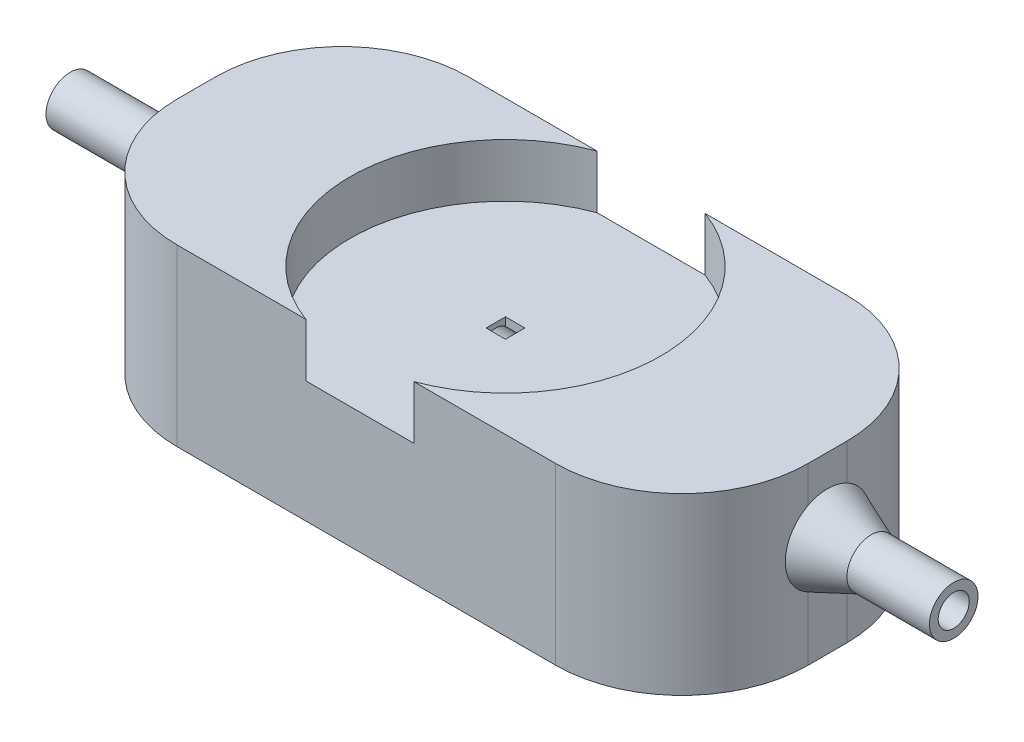
ISO-10303-21;
HEADER;
FILE_DESCRIPTION(('STEP AP214'),'2;1');
FILE_NAME('part.step','',(''),(''),'','','');
FILE_SCHEMA(('AUTOMOTIVE_DESIGN { 1 0 10303 214 1 1 1 1 }'));
ENDSEC;
DATA;
#1=APPLICATION_CONTEXT('core data for automotive mechanical design processes');
#2=APPLICATION_PROTOCOL_DEFINITION('international standard','automotive_design',2000,#1);
#3=PRODUCT_CONTEXT('',#1,'mechanical');
#4=PRODUCT('Part','Part','',(#3));
#5=PRODUCT_RELATED_PRODUCT_CATEGORY('part','',(#4));
#6=PRODUCT_DEFINITION_FORMATION('','',#4);
#7=PRODUCT_DEFINITION_CONTEXT('part definition',#1,'design');
#8=PRODUCT_DEFINITION('design','',#6,#7);
#9=PRODUCT_DEFINITION_SHAPE('','',#8);
#10=(LENGTH_UNIT() NAMED_UNIT(*) SI_UNIT(.MILLI.,.METRE.));
#11=(NAMED_UNIT(*) PLANE_ANGLE_UNIT() SI_UNIT($,.RADIAN.));
#12=(NAMED_UNIT(*) SI_UNIT($,.STERADIAN.) SOLID_ANGLE_UNIT());
#13=UNCERTAINTY_MEASURE_WITH_UNIT(LENGTH_MEASURE(1.E-05),#10,'distance_accuracy_value','');
#14=(GEOMETRIC_REPRESENTATION_CONTEXT(3) GLOBAL_UNCERTAINTY_ASSIGNED_CONTEXT((#13)) GLOBAL_UNIT_ASSIGNED_CONTEXT((#10,
#11,#12)) REPRESENTATION_CONTEXT('',''));
#15=CARTESIAN_POINT('',(0.,0.,0.));
#16=DIRECTION('',(0.,0.,1.));
#17=DIRECTION('',(1.,0.,0.));
#18=AXIS2_PLACEMENT_3D('',#15,#16,#17);
#19=CARTESIAN_POINT('',(40.,58.,15.));
#20=DIRECTION('',(-1.,0.,0.));
#21=DIRECTION('',(0.,0.,1.));
#22=AXIS2_PLACEMENT_3D('',#19,#20,#21);
#23=PLANE('',#22);
#24=DIRECTION('',(0.,-1.,0.));
#25=VECTOR('',#24,1.);
#26=CARTESIAN_POINT('',(40.,58.,2.00000000000001));
#27=LINE('',#26,#25);
#28=CARTESIAN_POINT('',(40.,58.,2.00000000000001));
#29=VERTEX_POINT('',#28);
#30=CARTESIAN_POINT('',(40.,54.2615312920012,2.00000000000001));
#31=VERTEX_POINT('',#30);
#32=EDGE_CURVE('E308',#29,#31,#27,.T.);
#33=ORIENTED_EDGE('',*,*,#32,.T.);
#34=CARTESIAN_POINT('',(40.,50.3985661096575,0.));
#35=DIRECTION('',(1.,0.,0.));
#36=DIRECTION('',(0.,0.,-1.));
#37=AXIS2_PLACEMENT_3D('',#34,#35,#36);
#38=CIRCLE('',#37,4.35);
#39=CARTESIAN_POINT('',(40.,54.2615312920012,-2.));
#40=VERTEX_POINT('',#39);
#41=EDGE_CURVE('E65',#40,#31,#38,.T.);
#42=ORIENTED_EDGE('',*,*,#41,.F.);
#43=DIRECTION('',(0.,-1.,0.));
#44=VECTOR('',#43,1.);
#45=CARTESIAN_POINT('',(40.,58.,-2.));
#46=LINE('',#45,#44);
#47=CARTESIAN_POINT('',(40.,58.,-2.));
#48=VERTEX_POINT('',#47);
#49=EDGE_CURVE('E313',#40,#48,#46,.F.);
#50=ORIENTED_EDGE('',*,*,#49,.T.);
#51=DIRECTION('',(0.,0.,-1.));
#52=VECTOR('',#51,1.);
#53=CARTESIAN_POINT('',(40.,58.,15.));
#54=LINE('',#53,#52);
#55=EDGE_CURVE('E311',#29,#48,#54,.T.);
#56=ORIENTED_EDGE('',*,*,#55,.F.);
#57=EDGE_LOOP('',(#33,#42,#50,#56));
#58=FACE_BOUND('',#57,.T.);
#59=ADVANCED_FACE('F45',(#58),#23,.F.);
#60=CARTESIAN_POINT('',(-25.,58.,15.));
#61=DIRECTION('',(1.,0.,0.));
#62=DIRECTION('',(0.,0.,-1.));
#63=AXIS2_PLACEMENT_3D('',#60,#61,#62);
#64=PLANE('',#63);
#65=DIRECTION('',(0.,-1.,0.));
#66=VECTOR('',#65,1.);
#67=CARTESIAN_POINT('',(-25.,58.,-1.99999999999999));
#68=LINE('',#67,#66);
#69=CARTESIAN_POINT('',(-25.,58.,-1.99999999999999));
#70=VERTEX_POINT('',#69);
#71=CARTESIAN_POINT('',(-25.,54.2628421718626,-1.99999999999999));
#72=VERTEX_POINT('',#71);
#73=EDGE_CURVE('E505',#70,#72,#68,.T.);
#74=ORIENTED_EDGE('',*,*,#73,.T.);
#75=CARTESIAN_POINT('',(-25.,50.4,0.));
#76=DIRECTION('',(1.,0.,0.));
#77=DIRECTION('',(0.,0.,-1.));
#78=AXIS2_PLACEMENT_3D('',#75,#76,#77);
#79=CIRCLE('',#78,4.34989076238934);
#80=CARTESIAN_POINT('',(-25.,54.2628421718626,2.00000000000001));
#81=VERTEX_POINT('',#80);
#82=EDGE_CURVE('E388',#72,#81,#79,.T.);
#83=ORIENTED_EDGE('',*,*,#82,.T.);
#84=DIRECTION('',(0.,-1.,0.));
#85=VECTOR('',#84,1.);
#86=CARTESIAN_POINT('',(-25.,58.,2.00000000000001));
#87=LINE('',#86,#85);
#88=CARTESIAN_POINT('',(-25.,58.,2.00000000000001));
#89=VERTEX_POINT('',#88);
#90=EDGE_CURVE('E500',#81,#89,#87,.F.);
#91=ORIENTED_EDGE('',*,*,#90,.T.);
#92=DIRECTION('',(0.,0.,1.));
#93=VECTOR('',#92,1.);
#94=CARTESIAN_POINT('',(-25.,58.,15.));
#95=LINE('',#94,#93);
#96=EDGE_CURVE('E477',#70,#89,#95,.T.);
#97=ORIENTED_EDGE('',*,*,#96,.F.);
#98=EDGE_LOOP('',(#74,#83,#91,#97));
#99=FACE_BOUND('',#98,.T.);
#100=ADVANCED_FACE('F279',(#99),#64,.F.);
#101=CARTESIAN_POINT('',(0.,58.,0.));
#102=DIRECTION('',(0.,-1.,0.));
#103=DIRECTION('',(0.,0.,-1.));
#104=AXIS2_PLACEMENT_3D('',#101,#102,#103);
#105=PLANE('',#104);
#106=DIRECTION('',(-1.,0.,0.));
#107=VECTOR('',#106,1.);
#108=CARTESIAN_POINT('',(-25.,58.,-15.));
#109=LINE('',#108,#107);
#110=CARTESIAN_POINT('',(27.,58.,-15.));
#111=VERTEX_POINT('',#110);
#112=CARTESIAN_POINT('',(12.3962726493241,58.,-15.));
#113=VERTEX_POINT('',#112);
#114=EDGE_CURVE('E474',#111,#113,#109,.T.);
#115=ORIENTED_EDGE('',*,*,#114,.T.);
#116=CARTESIAN_POINT('',(6.82850828649366,58.,-1.6826817716975E-13));
#117=DIRECTION('',(0.,1.,0.));
#118=DIRECTION('',(0.,0.,1.));
#119=AXIS2_PLACEMENT_3D('',#116,#117,#118);
#120=CIRCLE('',#119,16.);
#121=CARTESIAN_POINT('',(12.3962726493232,58.,15.));
#122=VERTEX_POINT('',#121);
#123=EDGE_CURVE('E226',#122,#113,#120,.T.);
#124=ORIENTED_EDGE('',*,*,#123,.F.);
#125=DIRECTION('',(1.,0.,0.));
#126=VECTOR('',#125,1.);
#127=CARTESIAN_POINT('',(-25.,58.,15.));
#128=LINE('',#127,#126);
#129=CARTESIAN_POINT('',(27.,58.,15.));
#130=VERTEX_POINT('',#129);
#131=EDGE_CURVE('E480',#122,#130,#128,.T.);
#132=ORIENTED_EDGE('',*,*,#131,.T.);
#133=CARTESIAN_POINT('',(27.,58.,2.00000000000001));
#134=DIRECTION('',(0.,-1.,0.));
#135=DIRECTION('',(0.,0.,-1.));
#136=AXIS2_PLACEMENT_3D('',#133,#134,#135);
#137=CIRCLE('',#136,13.);
#138=EDGE_CURVE('E494',#130,#29,#137,.F.);
#139=ORIENTED_EDGE('',*,*,#138,.T.);
#140=ORIENTED_EDGE('',*,*,#55,.T.);
#141=CARTESIAN_POINT('',(27.,58.,-2.));
#142=DIRECTION('',(0.,-1.,0.));
#143=DIRECTION('',(0.,0.,-1.));
#144=AXIS2_PLACEMENT_3D('',#141,#142,#143);
#145=CIRCLE('',#144,13.);
#146=EDGE_CURVE('E498',#48,#111,#145,.F.);
#147=ORIENTED_EDGE('',*,*,#146,.T.);
#148=EDGE_LOOP('',(#115,#124,#132,#139,#140,#147));
#149=FACE_BOUND('',#148,.T.);
#150=ADVANCED_FACE('F268',(#149),#105,.F.);
#151=CARTESIAN_POINT('',(40.,40.,-2.));
#152=VERTEX_POINT('',#151);
#153=CARTESIAN_POINT('',(40.,46.5356009273137,-2.));
#154=VERTEX_POINT('',#153);
#155=EDGE_CURVE('E490',#152,#154,#46,.F.);
#156=ORIENTED_EDGE('',*,*,#155,.T.);
#157=CARTESIAN_POINT('',(40.,46.5356009273137,2.00000000000001));
#158=VERTEX_POINT('',#157);
#159=EDGE_CURVE('E323',#158,#154,#38,.T.);
#160=ORIENTED_EDGE('',*,*,#159,.F.);
#161=CARTESIAN_POINT('',(40.,40.,2.00000000000001));
#162=VERTEX_POINT('',#161);
#163=EDGE_CURVE('E314',#158,#162,#27,.T.);
#164=ORIENTED_EDGE('',*,*,#163,.T.);
#165=DIRECTION('',(0.,0.,1.));
#166=VECTOR('',#165,1.);
#167=CARTESIAN_POINT('',(40.,40.,15.));
#168=LINE('',#167,#166);
#169=EDGE_CURVE('E466',#152,#162,#168,.T.);
#170=ORIENTED_EDGE('',*,*,#169,.F.);
#171=EDGE_LOOP('',(#156,#160,#164,#170));
#172=FACE_BOUND('',#171,.T.);
#173=ADVANCED_FACE('F282',(#172),#23,.F.);
#174=CARTESIAN_POINT('',(-25.,58.,-15.));
#175=DIRECTION('',(0.,0.,1.));
#176=DIRECTION('',(1.,0.,0.));
#177=AXIS2_PLACEMENT_3D('',#174,#175,#176);
#178=PLANE('',#177);
#179=DIRECTION('',(-1.,0.,0.));
#180=VECTOR('',#179,1.);
#181=CARTESIAN_POINT('',(-25.,52.5,-15.));
#182=LINE('',#181,#180);
#183=CARTESIAN_POINT('',(12.3962726493241,52.5,-15.));
#184=VERTEX_POINT('',#183);
#185=CARTESIAN_POINT('',(1.26074392366317,52.5,-15.));
#186=VERTEX_POINT('',#185);
#187=EDGE_CURVE('E451',#184,#186,#182,.T.);
#188=ORIENTED_EDGE('',*,*,#187,.F.);
#189=DIRECTION('',(0.,1.,0.));
#190=VECTOR('',#189,1.);
#191=CARTESIAN_POINT('',(12.3962726493241,52.5,-15.));
#192=LINE('',#191,#190);
#193=EDGE_CURVE('E448',#184,#113,#192,.T.);
#194=ORIENTED_EDGE('',*,*,#193,.T.);
#195=ORIENTED_EDGE('',*,*,#114,.F.);
#196=DIRECTION('',(0.,-1.,0.));
#197=VECTOR('',#196,1.);
#198=CARTESIAN_POINT('',(27.,58.,-15.));
#199=LINE('',#198,#197);
#200=CARTESIAN_POINT('',(27.,40.,-15.));
#201=VERTEX_POINT('',#200);
#202=EDGE_CURVE('E487',#111,#201,#199,.T.);
#203=ORIENTED_EDGE('',*,*,#202,.T.);
#204=DIRECTION('',(1.,0.,0.));
#205=VECTOR('',#204,1.);
#206=CARTESIAN_POINT('',(-25.,40.,-15.));
#207=LINE('',#206,#205);
#208=CARTESIAN_POINT('',(-12.,40.,-15.));
#209=VERTEX_POINT('',#208);
#210=EDGE_CURVE('E464',#209,#201,#207,.T.);
#211=ORIENTED_EDGE('',*,*,#210,.F.);
#212=DIRECTION('',(0.,-1.,0.));
#213=VECTOR('',#212,1.);
#214=CARTESIAN_POINT('',(-12.,58.,-15.));
#215=LINE('',#214,#213);
#216=CARTESIAN_POINT('',(-12.,58.,-15.));
#217=VERTEX_POINT('',#216);
#218=EDGE_CURVE('E484',#209,#217,#215,.F.);
#219=ORIENTED_EDGE('',*,*,#218,.T.);
#220=CARTESIAN_POINT('',(1.26074392366317,58.,-15.));
#221=VERTEX_POINT('',#220);
#222=EDGE_CURVE('E473',#221,#217,#109,.T.);
#223=ORIENTED_EDGE('',*,*,#222,.F.);
#224=DIRECTION('',(0.,1.,0.));
#225=VECTOR('',#224,1.);
#226=CARTESIAN_POINT('',(1.26074392366316,52.5,-15.));
#227=LINE('',#226,#225);
#228=EDGE_CURVE('E445',#221,#186,#227,.F.);
#229=ORIENTED_EDGE('',*,*,#228,.T.);
#230=EDGE_LOOP('',(#188,#194,#195,#203,#211,#219,#223,#229));
#231=FACE_BOUND('',#230,.T.);
#232=ADVANCED_FACE('F277',(#231),#178,.F.);
#233=CARTESIAN_POINT('',(-25.,40.,2.00000000000001));
#234=VERTEX_POINT('',#233);
#235=CARTESIAN_POINT('',(-25.,46.5371578281374,2.00000000000001));
#236=VERTEX_POINT('',#235);
#237=EDGE_CURVE('E501',#234,#236,#87,.F.);
#238=ORIENTED_EDGE('',*,*,#237,.T.);
#239=CARTESIAN_POINT('',(-25.,46.5371578281374,-1.99999999999999));
#240=VERTEX_POINT('',#239);
#241=EDGE_CURVE('E625',#236,#240,#79,.T.);
#242=ORIENTED_EDGE('',*,*,#241,.T.);
#243=CARTESIAN_POINT('',(-25.,40.,-1.99999999999999));
#244=VERTEX_POINT('',#243);
#245=EDGE_CURVE('E504',#240,#244,#68,.T.);
#246=ORIENTED_EDGE('',*,*,#245,.T.);
#247=DIRECTION('',(0.,0.,-1.));
#248=VECTOR('',#247,1.);
#249=CARTESIAN_POINT('',(-25.,40.,15.));
#250=LINE('',#249,#248);
#251=EDGE_CURVE('E455',#234,#244,#250,.T.);
#252=ORIENTED_EDGE('',*,*,#251,.F.);
#253=EDGE_LOOP('',(#238,#242,#246,#252));
#254=FACE_BOUND('',#253,.T.);
#255=ADVANCED_FACE('F273',(#254),#64,.F.);
#256=CARTESIAN_POINT('',(-25.,58.,15.));
#257=DIRECTION('',(0.,0.,-1.));
#258=DIRECTION('',(-1.,0.,0.));
#259=AXIS2_PLACEMENT_3D('',#256,#257,#258);
#260=PLANE('',#259);
#261=DIRECTION('',(1.,0.,0.));
#262=VECTOR('',#261,1.);
#263=CARTESIAN_POINT('',(-25.,52.5,15.));
#264=LINE('',#263,#262);
#265=CARTESIAN_POINT('',(1.2607439236641,52.5,15.));
#266=VERTEX_POINT('',#265);
#267=CARTESIAN_POINT('',(12.3962726493232,52.5,15.));
#268=VERTEX_POINT('',#267);
#269=EDGE_CURVE('E520',#266,#268,#264,.T.);
#270=ORIENTED_EDGE('',*,*,#269,.F.);
#271=DIRECTION('',(0.,1.,0.));
#272=VECTOR('',#271,1.);
#273=CARTESIAN_POINT('',(1.26074392366409,52.5,15.));
#274=LINE('',#273,#272);
#275=CARTESIAN_POINT('',(1.2607439236641,58.,15.));
#276=VERTEX_POINT('',#275);
#277=EDGE_CURVE('E442',#266,#276,#274,.T.);
#278=ORIENTED_EDGE('',*,*,#277,.T.);
#279=CARTESIAN_POINT('',(-12.,58.,15.));
#280=VERTEX_POINT('',#279);
#281=EDGE_CURVE('E481',#280,#276,#128,.T.);
#282=ORIENTED_EDGE('',*,*,#281,.F.);
#283=DIRECTION('',(0.,-1.,0.));
#284=VECTOR('',#283,1.);
#285=CARTESIAN_POINT('',(-12.,58.,15.));
#286=LINE('',#285,#284);
#287=CARTESIAN_POINT('',(-12.,40.,15.));
#288=VERTEX_POINT('',#287);
#289=EDGE_CURVE('E508',#280,#288,#286,.T.);
#290=ORIENTED_EDGE('',*,*,#289,.T.);
#291=DIRECTION('',(-1.,0.,0.));
#292=VECTOR('',#291,1.);
#293=CARTESIAN_POINT('',(-25.,40.,15.));
#294=LINE('',#293,#292);
#295=CARTESIAN_POINT('',(27.,40.,15.));
#296=VERTEX_POINT('',#295);
#297=EDGE_CURVE('E453',#296,#288,#294,.T.);
#298=ORIENTED_EDGE('',*,*,#297,.F.);
#299=DIRECTION('',(0.,-1.,0.));
#300=VECTOR('',#299,1.);
#301=CARTESIAN_POINT('',(27.,58.,15.));
#302=LINE('',#301,#300);
#303=EDGE_CURVE('E511',#296,#130,#302,.F.);
#304=ORIENTED_EDGE('',*,*,#303,.T.);
#305=ORIENTED_EDGE('',*,*,#131,.F.);
#306=DIRECTION('',(0.,1.,0.));
#307=VECTOR('',#306,1.);
#308=CARTESIAN_POINT('',(12.3962726493232,52.5,15.));
#309=LINE('',#308,#307);
#310=EDGE_CURVE('E437',#122,#268,#309,.F.);
#311=ORIENTED_EDGE('',*,*,#310,.T.);
#312=EDGE_LOOP('',(#270,#278,#282,#290,#298,#304,#305,#311));
#313=FACE_BOUND('',#312,.T.);
#314=ADVANCED_FACE('F269',(#313),#260,.F.);
#315=CARTESIAN_POINT('',(27.,58.,-2.));
#316=DIRECTION('',(0.,-1.,0.));
#317=DIRECTION('',(0.,0.,-1.));
#318=AXIS2_PLACEMENT_3D('',#315,#316,#317);
#319=CYLINDRICAL_SURFACE('',#318,13.);
#320=ORIENTED_EDGE('',*,*,#155,.F.);
#321=CARTESIAN_POINT('',(27.,40.,-2.));
#322=DIRECTION('',(0.,-1.,0.));
#323=DIRECTION('',(0.,0.,-1.));
#324=AXIS2_PLACEMENT_3D('',#321,#322,#323);
#325=CIRCLE('',#324,13.);
#326=EDGE_CURVE('E469',#152,#201,#325,.F.);
#327=ORIENTED_EDGE('',*,*,#326,.T.);
#328=ORIENTED_EDGE('',*,*,#202,.F.);
#329=ORIENTED_EDGE('',*,*,#146,.F.);
#330=ORIENTED_EDGE('',*,*,#49,.F.);
#331=DIRECTION('',(0.,-1.,0.));
#332=VECTOR('',#331,1.);
#333=CARTESIAN_POINT('',(40.,58.,-2.));
#334=LINE('',#333,#332);
#335=EDGE_CURVE('E72',#154,#40,#334,.F.);
#336=ORIENTED_EDGE('',*,*,#335,.F.);
#337=EDGE_LOOP('',(#320,#327,#328,#329,#330,#336));
#338=FACE_BOUND('',#337,.T.);
#339=ADVANCED_FACE('F272',(#338),#319,.T.);
#340=CARTESIAN_POINT('',(-12.,58.,-1.99999999999999));
#341=DIRECTION('',(0.,-1.,0.));
#342=DIRECTION('',(0.,0.,-1.));
#343=AXIS2_PLACEMENT_3D('',#340,#341,#342);
#344=CYLINDRICAL_SURFACE('',#343,13.);
#345=ORIENTED_EDGE('',*,*,#218,.F.);
#346=CARTESIAN_POINT('',(-12.,40.,-1.99999999999999));
#347=DIRECTION('',(0.,-1.,0.));
#348=DIRECTION('',(0.,0.,-1.));
#349=AXIS2_PLACEMENT_3D('',#346,#347,#348);
#350=CIRCLE('',#349,13.);
#351=EDGE_CURVE('E461',#209,#244,#350,.F.);
#352=ORIENTED_EDGE('',*,*,#351,.T.);
#353=ORIENTED_EDGE('',*,*,#245,.F.);
#354=DIRECTION('',(0.,-1.,0.));
#355=VECTOR('',#354,1.);
#356=CARTESIAN_POINT('',(-25.,58.,-1.99999999999999));
#357=LINE('',#356,#355);
#358=EDGE_CURVE('E395',#240,#72,#357,.F.);
#359=ORIENTED_EDGE('',*,*,#358,.T.);
#360=ORIENTED_EDGE('',*,*,#73,.F.);
#361=CARTESIAN_POINT('',(-12.,58.,-1.99999999999999));
#362=DIRECTION('',(0.,-1.,0.));
#363=DIRECTION('',(0.,0.,-1.));
#364=AXIS2_PLACEMENT_3D('',#361,#362,#363);
#365=CIRCLE('',#364,13.);
#366=EDGE_CURVE('E496',#217,#70,#365,.F.);
#367=ORIENTED_EDGE('',*,*,#366,.F.);
#368=EDGE_LOOP('',(#345,#352,#353,#359,#360,#367));
#369=FACE_BOUND('',#368,.T.);
#370=ADVANCED_FACE('F289',(#369),#344,.T.);
#371=CARTESIAN_POINT('',(27.,58.,2.00000000000001));
#372=DIRECTION('',(0.,-1.,0.));
#373=DIRECTION('',(0.,0.,-1.));
#374=AXIS2_PLACEMENT_3D('',#371,#372,#373);
#375=CYLINDRICAL_SURFACE('',#374,13.);
#376=ORIENTED_EDGE('',*,*,#303,.F.);
#377=CARTESIAN_POINT('',(27.,40.,2.00000000000001));
#378=DIRECTION('',(0.,-1.,0.));
#379=DIRECTION('',(0.,0.,-1.));
#380=AXIS2_PLACEMENT_3D('',#377,#378,#379);
#381=CIRCLE('',#380,13.);
#382=EDGE_CURVE('E458',#296,#162,#381,.F.);
#383=ORIENTED_EDGE('',*,*,#382,.T.);
#384=ORIENTED_EDGE('',*,*,#163,.F.);
#385=DIRECTION('',(0.,-1.,0.));
#386=VECTOR('',#385,1.);
#387=CARTESIAN_POINT('',(40.,58.,2.00000000000001));
#388=LINE('',#387,#386);
#389=EDGE_CURVE('E232',#158,#31,#388,.F.);
#390=ORIENTED_EDGE('',*,*,#389,.T.);
#391=ORIENTED_EDGE('',*,*,#32,.F.);
#392=ORIENTED_EDGE('',*,*,#138,.F.);
#393=EDGE_LOOP('',(#376,#383,#384,#390,#391,#392));
#394=FACE_BOUND('',#393,.T.);
#395=ADVANCED_FACE('F291',(#394),#375,.T.);
#396=CARTESIAN_POINT('',(-12.,58.,2.00000000000001));
#397=DIRECTION('',(0.,-1.,0.));
#398=DIRECTION('',(0.,0.,-1.));
#399=AXIS2_PLACEMENT_3D('',#396,#397,#398);
#400=CYLINDRICAL_SURFACE('',#399,13.);
#401=ORIENTED_EDGE('',*,*,#237,.F.);
#402=CARTESIAN_POINT('',(-12.,40.,2.00000000000001));
#403=DIRECTION('',(0.,-1.,0.));
#404=DIRECTION('',(0.,0.,-1.));
#405=AXIS2_PLACEMENT_3D('',#402,#403,#404);
#406=CIRCLE('',#405,13.);
#407=EDGE_CURVE('E514',#234,#288,#406,.F.);
#408=ORIENTED_EDGE('',*,*,#407,.T.);
#409=ORIENTED_EDGE('',*,*,#289,.F.);
#410=CARTESIAN_POINT('',(-12.,58.,2.00000000000001));
#411=DIRECTION('',(0.,-1.,0.));
#412=DIRECTION('',(0.,0.,-1.));
#413=AXIS2_PLACEMENT_3D('',#410,#411,#412);
#414=CIRCLE('',#413,13.);
#415=EDGE_CURVE('E492',#89,#280,#414,.F.);
#416=ORIENTED_EDGE('',*,*,#415,.F.);
#417=ORIENTED_EDGE('',*,*,#90,.F.);
#418=DIRECTION('',(0.,-1.,0.));
#419=VECTOR('',#418,1.);
#420=CARTESIAN_POINT('',(-25.,58.,2.00000000000001));
#421=LINE('',#420,#419);
#422=EDGE_CURVE('E391',#236,#81,#421,.F.);
#423=ORIENTED_EDGE('',*,*,#422,.F.);
#424=EDGE_LOOP('',(#401,#408,#409,#416,#417,#423));
#425=FACE_BOUND('',#424,.T.);
#426=ADVANCED_FACE('F47',(#425),#400,.T.);
#427=ORIENTED_EDGE('',*,*,#281,.T.);
#428=CARTESIAN_POINT('',(6.82850828649366,58.,-1.6826817716975E-13));
#429=DIRECTION('',(0.,-1.,0.));
#430=DIRECTION('',(0.,0.,-1.));
#431=AXIS2_PLACEMENT_3D('',#428,#429,#430);
#432=CIRCLE('',#431,16.);
#433=EDGE_CURVE('E517',#276,#221,#432,.T.);
#434=ORIENTED_EDGE('',*,*,#433,.T.);
#435=ORIENTED_EDGE('',*,*,#222,.T.);
#436=ORIENTED_EDGE('',*,*,#366,.T.);
#437=ORIENTED_EDGE('',*,*,#96,.T.);
#438=ORIENTED_EDGE('',*,*,#415,.T.);
#439=EDGE_LOOP('',(#427,#434,#435,#436,#437,#438));
#440=FACE_BOUND('',#439,.T.);
#441=ADVANCED_FACE('F263',(#440),#105,.F.);
#442=CARTESIAN_POINT('',(0.,40.,0.));
#443=DIRECTION('',(0.,-1.,0.));
#444=DIRECTION('',(0.,0.,-1.));
#445=AXIS2_PLACEMENT_3D('',#442,#443,#444);
#446=PLANE('',#445);
#447=ORIENTED_EDGE('',*,*,#169,.T.);
#448=ORIENTED_EDGE('',*,*,#382,.F.);
#449=ORIENTED_EDGE('',*,*,#297,.T.);
#450=ORIENTED_EDGE('',*,*,#407,.F.);
#451=ORIENTED_EDGE('',*,*,#251,.T.);
#452=ORIENTED_EDGE('',*,*,#351,.F.);
#453=ORIENTED_EDGE('',*,*,#210,.T.);
#454=ORIENTED_EDGE('',*,*,#326,.F.);
#455=EDGE_LOOP('',(#447,#448,#449,#450,#451,#452,#453,#454));
#456=FACE_BOUND('',#455,.T.);
#457=ADVANCED_FACE('F256',(#456),#446,.T.);
#458=CARTESIAN_POINT('',(6.82850828649366,52.5,-1.6826817716975E-13));
#459=DIRECTION('',(0.,1.,0.));
#460=DIRECTION('',(0.,0.,1.));
#461=AXIS2_PLACEMENT_3D('',#458,#459,#460);
#462=PLANE('',#461);
#463=DIRECTION('',(0.,0.,-1.));
#464=VECTOR('',#463,1.);
#465=CARTESIAN_POINT('',(7.82850828649366,52.5,0.999999999999832));
#466=LINE('',#465,#464);
#467=CARTESIAN_POINT('',(7.82850828649366,52.5,0.999999999999832));
#468=VERTEX_POINT('',#467);
#469=CARTESIAN_POINT('',(7.82850828649366,52.5,-1.00000000000017));
#470=VERTEX_POINT('',#469);
#471=EDGE_CURVE('E397',#468,#470,#466,.T.);
#472=ORIENTED_EDGE('',*,*,#471,.F.);
#473=DIRECTION('',(1.,0.,0.));
#474=VECTOR('',#473,1.);
#475=CARTESIAN_POINT('',(5.82850828649366,52.5,0.999999999999832));
#476=LINE('',#475,#474);
#477=CARTESIAN_POINT('',(5.82850828649366,52.5,0.999999999999832));
#478=VERTEX_POINT('',#477);
#479=EDGE_CURVE('E402',#478,#468,#476,.T.);
#480=ORIENTED_EDGE('',*,*,#479,.F.);
#481=DIRECTION('',(0.,0.,1.));
#482=VECTOR('',#481,1.);
#483=CARTESIAN_POINT('',(5.82850828649366,52.5,0.999999999999832));
#484=LINE('',#483,#482);
#485=CARTESIAN_POINT('',(5.82850828649366,52.5,-1.00000000000017));
#486=VERTEX_POINT('',#485);
#487=EDGE_CURVE('E416',#486,#478,#484,.T.);
#488=ORIENTED_EDGE('',*,*,#487,.F.);
#489=DIRECTION('',(-1.,0.,0.));
#490=VECTOR('',#489,1.);
#491=CARTESIAN_POINT('',(5.82850828649366,52.5,-1.00000000000017));
#492=LINE('',#491,#490);
#493=EDGE_CURVE('E413',#470,#486,#492,.T.);
#494=ORIENTED_EDGE('',*,*,#493,.F.);
#495=EDGE_LOOP('',(#472,#480,#488,#494));
#496=FACE_BOUND('',#495,.T.);
#497=ORIENTED_EDGE('',*,*,#187,.T.);
#498=CARTESIAN_POINT('',(6.82850828649366,52.5,-1.6826817716975E-13));
#499=DIRECTION('',(0.,1.,0.));
#500=DIRECTION('',(0.,0.,1.));
#501=AXIS2_PLACEMENT_3D('',#498,#499,#500);
#502=CIRCLE('',#501,16.);
#503=EDGE_CURVE('E438',#186,#266,#502,.T.);
#504=ORIENTED_EDGE('',*,*,#503,.T.);
#505=ORIENTED_EDGE('',*,*,#269,.T.);
#506=EDGE_CURVE('E434',#268,#184,#502,.T.);
#507=ORIENTED_EDGE('',*,*,#506,.T.);
#508=EDGE_LOOP('',(#497,#504,#505,#507));
#509=FACE_BOUND('',#508,.T.);
#510=ADVANCED_FACE('F251',(#496,#509),#462,.T.);
#511=CARTESIAN_POINT('',(6.82850828649366,52.5,-1.6826817716975E-13));
#512=DIRECTION('',(0.,1.,0.));
#513=DIRECTION('',(0.,0.,1.));
#514=AXIS2_PLACEMENT_3D('',#511,#512,#513);
#515=CYLINDRICAL_SURFACE('',#514,16.);
#516=ORIENTED_EDGE('',*,*,#506,.F.);
#517=ORIENTED_EDGE('',*,*,#310,.F.);
#518=ORIENTED_EDGE('',*,*,#123,.T.);
#519=ORIENTED_EDGE('',*,*,#193,.F.);
#520=EDGE_LOOP('',(#516,#517,#518,#519));
#521=FACE_BOUND('',#520,.T.);
#522=ADVANCED_FACE('F255',(#521),#515,.F.);
#523=ORIENTED_EDGE('',*,*,#433,.F.);
#524=ORIENTED_EDGE('',*,*,#277,.F.);
#525=ORIENTED_EDGE('',*,*,#503,.F.);
#526=ORIENTED_EDGE('',*,*,#228,.F.);
#527=EDGE_LOOP('',(#523,#524,#525,#526));
#528=FACE_BOUND('',#527,.T.);
#529=ADVANCED_FACE('F247',(#528),#515,.F.);
#530=CARTESIAN_POINT('',(40.001,50.4,0.));
#531=DIRECTION('',(-1.,0.,0.));
#532=DIRECTION('',(0.,0.,1.));
#533=AXIS2_PLACEMENT_3D('',#530,#531,#532);
#534=CYLINDRICAL_SURFACE('',#533,1.6);
#535=DIRECTION('',(-1.,0.,0.));
#536=VECTOR('',#535,1.);
#537=CARTESIAN_POINT('',(40.001,49.1510004003205,-1.00000000000017));
#538=LINE('',#537,#536);
#539=CARTESIAN_POINT('',(5.82850828649366,49.1510004003205,-1.00000000000017));
#540=VERTEX_POINT('',#539);
#541=CARTESIAN_POINT('',(7.82850828649365,49.1510004003205,-1.00000000000017));
#542=VERTEX_POINT('',#541);
#543=EDGE_CURVE('E533',#540,#542,#538,.F.);
#544=ORIENTED_EDGE('',*,*,#543,.T.);
#545=CARTESIAN_POINT('',(7.82850828649365,50.4,0.));
#546=DIRECTION('',(1.,0.,0.));
#547=DIRECTION('',(0.,0.,-1.));
#548=AXIS2_PLACEMENT_3D('',#545,#546,#547);
#549=CIRCLE('',#548,1.6);
#550=CARTESIAN_POINT('',(7.82850828649366,49.1510004003202,0.999999999999832));
#551=VERTEX_POINT('',#550);
#552=EDGE_CURVE('E11',#542,#551,#549,.F.);
#553=ORIENTED_EDGE('',*,*,#552,.T.);
#554=DIRECTION('',(-1.,0.,0.));
#555=VECTOR('',#554,1.);
#556=CARTESIAN_POINT('',(40.001,49.1510004003202,0.999999999999832));
#557=LINE('',#556,#555);
#558=CARTESIAN_POINT('',(5.82850828649366,49.1510004003202,0.999999999999832));
#559=VERTEX_POINT('',#558);
#560=EDGE_CURVE('E56',#551,#559,#557,.T.);
#561=ORIENTED_EDGE('',*,*,#560,.T.);
#562=CARTESIAN_POINT('',(5.82850828649366,50.4,0.));
#563=DIRECTION('',(-1.,0.,0.));
#564=DIRECTION('',(0.,0.,1.));
#565=AXIS2_PLACEMENT_3D('',#562,#563,#564);
#566=CIRCLE('',#565,1.6);
#567=EDGE_CURVE('E529',#559,#540,#566,.F.);
#568=ORIENTED_EDGE('',*,*,#567,.T.);
#569=EDGE_LOOP('',(#544,#553,#561,#568));
#570=FACE_BOUND('',#569,.T.);
#571=DIRECTION('',(-1.,0.,0.));
#572=VECTOR('',#571,1.);
#573=CARTESIAN_POINT('',(40.001,51.6489995996798,0.999999999999832));
#574=LINE('',#573,#572);
#575=CARTESIAN_POINT('',(5.82850828649366,51.6489995996798,0.999999999999832));
#576=VERTEX_POINT('',#575);
#577=CARTESIAN_POINT('',(7.82850828649366,51.6489995996798,0.999999999999832));
#578=VERTEX_POINT('',#577);
#579=EDGE_CURVE('E528',#576,#578,#574,.F.);
#580=ORIENTED_EDGE('',*,*,#579,.T.);
#581=CARTESIAN_POINT('',(7.82850828649366,51.6489995996795,-1.00000000000017));
#582=VERTEX_POINT('',#581);
#583=EDGE_CURVE('E58',#578,#582,#549,.F.);
#584=ORIENTED_EDGE('',*,*,#583,.T.);
#585=DIRECTION('',(-1.,0.,0.));
#586=VECTOR('',#585,1.);
#587=CARTESIAN_POINT('',(40.001,51.6489995996795,-1.00000000000017));
#588=LINE('',#587,#586);
#589=CARTESIAN_POINT('',(5.82850828649366,51.6489995996795,-1.00000000000017));
#590=VERTEX_POINT('',#589);
#591=EDGE_CURVE('E522',#582,#590,#588,.T.);
#592=ORIENTED_EDGE('',*,*,#591,.T.);
#593=EDGE_CURVE('E525',#590,#576,#566,.F.);
#594=ORIENTED_EDGE('',*,*,#593,.T.);
#595=EDGE_LOOP('',(#580,#584,#592,#594));
#596=FACE_BOUND('',#595,.T.);
#597=CARTESIAN_POINT('',(40.,50.4,0.));
#598=DIRECTION('',(1.,0.,0.));
#599=DIRECTION('',(0.,-0.000448090732643736,0.999999899607343));
#600=AXIS2_PLACEMENT_3D('',#597,#598,#599);
#601=CIRCLE('',#600,1.6);
#602=CARTESIAN_POINT('',(40.,50.3992830548278,1.59999983937175));
#603=VERTEX_POINT('',#602);
#604=CARTESIAN_POINT('',(40.,50.3992830548278,-1.59999983937175));
#605=VERTEX_POINT('',#604);
#606=EDGE_CURVE('E222',#603,#605,#601,.T.);
#607=ORIENTED_EDGE('',*,*,#606,.T.);
#608=CARTESIAN_POINT('',(40.,50.4,0.));
#609=DIRECTION('',(1.,0.,0.));
#610=DIRECTION('',(0.,-0.000448090732643736,-0.999999899607343));
#611=AXIS2_PLACEMENT_3D('',#608,#609,#610);
#612=CIRCLE('',#611,1.6);
#613=EDGE_CURVE('E218',#605,#603,#612,.T.);
#614=ORIENTED_EDGE('',*,*,#613,.T.);
#615=EDGE_LOOP('',(#607,#614));
#616=FACE_BOUND('',#615,.T.);
#617=CARTESIAN_POINT('',(-38.,50.4,0.));
#618=DIRECTION('',(1.,0.,0.));
#619=DIRECTION('',(0.,0.,-1.));
#620=AXIS2_PLACEMENT_3D('',#617,#618,#619);
#621=CIRCLE('',#620,1.6);
#622=CARTESIAN_POINT('',(-38.,50.4,-1.6));
#623=VERTEX_POINT('',#622);
#624=EDGE_CURVE('E373',#623,#623,#621,.T.);
#625=ORIENTED_EDGE('',*,*,#624,.F.);
#626=EDGE_LOOP('',(#625));
#627=FACE_BOUND('',#626,.T.);
#628=ADVANCED_FACE('F230',(#570,#596,#616,#627),#534,.F.);
#629=CARTESIAN_POINT('',(5.82850828649366,44.5,-1.00000000000017));
#630=DIRECTION('',(0.,0.,-1.));
#631=DIRECTION('',(-1.,0.,0.));
#632=AXIS2_PLACEMENT_3D('',#629,#630,#631);
#633=PLANE('',#632);
#634=DIRECTION('',(0.,1.,0.));
#635=VECTOR('',#634,1.);
#636=CARTESIAN_POINT('',(7.82850828649366,44.5,-1.00000000000017));
#637=LINE('',#636,#635);
#638=EDGE_CURVE('E411',#582,#470,#637,.T.);
#639=ORIENTED_EDGE('',*,*,#638,.T.);
#640=ORIENTED_EDGE('',*,*,#493,.T.);
#641=DIRECTION('',(0.,1.,0.));
#642=VECTOR('',#641,1.);
#643=CARTESIAN_POINT('',(5.82850828649366,44.5,-1.00000000000017));
#644=LINE('',#643,#642);
#645=EDGE_CURVE('E431',#590,#486,#644,.T.);
#646=ORIENTED_EDGE('',*,*,#645,.F.);
#647=ORIENTED_EDGE('',*,*,#591,.F.);
#648=EDGE_LOOP('',(#639,#640,#646,#647));
#649=FACE_BOUND('',#648,.T.);
#650=ADVANCED_FACE('F246',(#649),#633,.F.);
#651=CARTESIAN_POINT('',(5.82850828649366,44.5,0.999999999999832));
#652=DIRECTION('',(-1.,0.,0.));
#653=DIRECTION('',(0.,0.,1.));
#654=AXIS2_PLACEMENT_3D('',#651,#652,#653);
#655=PLANE('',#654);
#656=ORIENTED_EDGE('',*,*,#645,.T.);
#657=ORIENTED_EDGE('',*,*,#487,.T.);
#658=DIRECTION('',(0.,1.,0.));
#659=VECTOR('',#658,1.);
#660=CARTESIAN_POINT('',(5.82850828649366,44.5,0.999999999999832));
#661=LINE('',#660,#659);
#662=EDGE_CURVE('E427',#576,#478,#661,.T.);
#663=ORIENTED_EDGE('',*,*,#662,.F.);
#664=ORIENTED_EDGE('',*,*,#593,.F.);
#665=EDGE_LOOP('',(#656,#657,#663,#664));
#666=FACE_BOUND('',#665,.T.);
#667=ADVANCED_FACE('F564',(#666),#655,.F.);
#668=CARTESIAN_POINT('',(5.82850828649366,44.5,0.999999999999832));
#669=DIRECTION('',(0.,0.,1.));
#670=DIRECTION('',(1.,0.,0.));
#671=AXIS2_PLACEMENT_3D('',#668,#669,#670);
#672=PLANE('',#671);
#673=ORIENTED_EDGE('',*,*,#662,.T.);
#674=ORIENTED_EDGE('',*,*,#479,.T.);
#675=DIRECTION('',(0.,1.,0.));
#676=VECTOR('',#675,1.);
#677=CARTESIAN_POINT('',(7.82850828649366,44.5,0.999999999999832));
#678=LINE('',#677,#676);
#679=EDGE_CURVE('E423',#578,#468,#678,.T.);
#680=ORIENTED_EDGE('',*,*,#679,.F.);
#681=ORIENTED_EDGE('',*,*,#579,.F.);
#682=EDGE_LOOP('',(#673,#674,#680,#681));
#683=FACE_BOUND('',#682,.T.);
#684=ADVANCED_FACE('F559',(#683),#672,.F.);
#685=CARTESIAN_POINT('',(7.82850828649366,44.5,0.999999999999832));
#686=DIRECTION('',(1.,0.,0.));
#687=DIRECTION('',(0.,0.,-1.));
#688=AXIS2_PLACEMENT_3D('',#685,#686,#687);
#689=PLANE('',#688);
#690=ORIENTED_EDGE('',*,*,#679,.T.);
#691=ORIENTED_EDGE('',*,*,#471,.T.);
#692=ORIENTED_EDGE('',*,*,#638,.F.);
#693=ORIENTED_EDGE('',*,*,#583,.F.);
#694=EDGE_LOOP('',(#690,#691,#692,#693));
#695=FACE_BOUND('',#694,.T.);
#696=ADVANCED_FACE('F553',(#695),#689,.F.);
#697=CARTESIAN_POINT('',(7.82850828649366,44.5,-1.00000000000017));
#698=VERTEX_POINT('',#697);
#699=EDGE_CURVE('E432',#698,#542,#637,.T.);
#700=ORIENTED_EDGE('',*,*,#699,.F.);
#701=DIRECTION('',(0.,0.,-1.));
#702=VECTOR('',#701,1.);
#703=CARTESIAN_POINT('',(7.82850828649366,44.5,0.999999999999832));
#704=LINE('',#703,#702);
#705=CARTESIAN_POINT('',(7.82850828649366,44.5,0.999999999999832));
#706=VERTEX_POINT('',#705);
#707=EDGE_CURVE('E398',#706,#698,#704,.T.);
#708=ORIENTED_EDGE('',*,*,#707,.F.);
#709=EDGE_CURVE('E227',#706,#551,#678,.T.);
#710=ORIENTED_EDGE('',*,*,#709,.T.);
#711=ORIENTED_EDGE('',*,*,#552,.F.);
#712=EDGE_LOOP('',(#700,#708,#710,#711));
#713=FACE_BOUND('',#712,.T.);
#714=ADVANCED_FACE('F249',(#713),#689,.F.);
#715=ORIENTED_EDGE('',*,*,#709,.F.);
#716=DIRECTION('',(1.,0.,0.));
#717=VECTOR('',#716,1.);
#718=CARTESIAN_POINT('',(5.82850828649366,44.5,0.999999999999832));
#719=LINE('',#718,#717);
#720=CARTESIAN_POINT('',(5.82850828649366,44.5,0.999999999999832));
#721=VERTEX_POINT('',#720);
#722=EDGE_CURVE('E408',#721,#706,#719,.T.);
#723=ORIENTED_EDGE('',*,*,#722,.F.);
#724=EDGE_CURVE('E424',#721,#559,#661,.T.);
#725=ORIENTED_EDGE('',*,*,#724,.T.);
#726=ORIENTED_EDGE('',*,*,#560,.F.);
#727=EDGE_LOOP('',(#715,#723,#725,#726));
#728=FACE_BOUND('',#727,.T.);
#729=ADVANCED_FACE('F543',(#728),#672,.F.);
#730=ORIENTED_EDGE('',*,*,#724,.F.);
#731=DIRECTION('',(0.,0.,1.));
#732=VECTOR('',#731,1.);
#733=CARTESIAN_POINT('',(5.82850828649366,44.5,0.999999999999832));
#734=LINE('',#733,#732);
#735=CARTESIAN_POINT('',(5.82850828649366,44.5,-1.00000000000017));
#736=VERTEX_POINT('',#735);
#737=EDGE_CURVE('E405',#736,#721,#734,.T.);
#738=ORIENTED_EDGE('',*,*,#737,.F.);
#739=EDGE_CURVE('E428',#736,#540,#644,.T.);
#740=ORIENTED_EDGE('',*,*,#739,.T.);
#741=ORIENTED_EDGE('',*,*,#567,.F.);
#742=EDGE_LOOP('',(#730,#738,#740,#741));
#743=FACE_BOUND('',#742,.T.);
#744=ADVANCED_FACE('F539',(#743),#655,.F.);
#745=ORIENTED_EDGE('',*,*,#739,.F.);
#746=DIRECTION('',(-1.,0.,0.));
#747=VECTOR('',#746,1.);
#748=CARTESIAN_POINT('',(5.82850828649366,44.5,-1.00000000000017));
#749=LINE('',#748,#747);
#750=EDGE_CURVE('E401',#698,#736,#749,.T.);
#751=ORIENTED_EDGE('',*,*,#750,.F.);
#752=ORIENTED_EDGE('',*,*,#699,.T.);
#753=ORIENTED_EDGE('',*,*,#543,.F.);
#754=EDGE_LOOP('',(#745,#751,#752,#753));
#755=FACE_BOUND('',#754,.T.);
#756=ADVANCED_FACE('F549',(#755),#633,.F.);
#757=CARTESIAN_POINT('',(0.,44.5,0.));
#758=DIRECTION('',(0.,-1.,0.));
#759=DIRECTION('',(0.,0.,-1.));
#760=AXIS2_PLACEMENT_3D('',#757,#758,#759);
#761=PLANE('',#760);
#762=ORIENTED_EDGE('',*,*,#707,.T.);
#763=ORIENTED_EDGE('',*,*,#750,.T.);
#764=ORIENTED_EDGE('',*,*,#737,.T.);
#765=ORIENTED_EDGE('',*,*,#722,.T.);
#766=EDGE_LOOP('',(#762,#763,#764,#765));
#767=FACE_BOUND('',#766,.T.);
#768=ADVANCED_FACE('F546',(#767),#761,.F.);
#769=CARTESIAN_POINT('',(-25.,52.,0.));
#770=DIRECTION('',(1.,0.,0.));
#771=DIRECTION('',(0.,0.,-1.));
#772=AXIS2_PLACEMENT_3D('',#769,#770,#771);
#773=PLANE('',#772);
#774=ORIENTED_EDGE('',*,*,#358,.F.);
#775=EDGE_CURVE('E387',#240,#72,#79,.T.);
#776=ORIENTED_EDGE('',*,*,#775,.T.);
#777=EDGE_LOOP('',(#774,#776));
#778=FACE_BOUND('',#777,.T.);
#779=ADVANCED_FACE('F590',(#778),#773,.T.);
#780=EDGE_CURVE('E392',#81,#236,#79,.T.);
#781=ORIENTED_EDGE('',*,*,#780,.T.);
#782=ORIENTED_EDGE('',*,*,#422,.T.);
#783=EDGE_LOOP('',(#781,#782));
#784=FACE_BOUND('',#783,.T.);
#785=ADVANCED_FACE('F595',(#784),#773,.T.);
#786=CARTESIAN_POINT('',(-25.,50.4,0.));
#787=DIRECTION('',(1.,0.,0.));
#788=DIRECTION('',(0.,0.,-1.));
#789=AXIS2_PLACEMENT_3D('',#786,#787,#788);
#790=CONICAL_SURFACE('',#789,4.34989076238934,0.39002730667281);
#791=CARTESIAN_POINT('',(-29.5,50.4,0.));
#792=DIRECTION('',(1.,0.,0.));
#793=DIRECTION('',(0.,0.,-1.));
#794=AXIS2_PLACEMENT_3D('',#791,#792,#793);
#795=CIRCLE('',#794,2.5);
#796=CARTESIAN_POINT('',(-29.5,50.4,-2.5));
#797=VERTEX_POINT('',#796);
#798=EDGE_CURVE('E384',#797,#797,#795,.T.);
#799=ORIENTED_EDGE('',*,*,#798,.T.);
#800=EDGE_LOOP('',(#799));
#801=FACE_BOUND('',#800,.T.);
#802=ORIENTED_EDGE('',*,*,#82,.F.);
#803=ORIENTED_EDGE('',*,*,#775,.F.);
#804=ORIENTED_EDGE('',*,*,#241,.F.);
#805=ORIENTED_EDGE('',*,*,#780,.F.);
#806=EDGE_LOOP('',(#802,#803,#804,#805));
#807=FACE_BOUND('',#806,.T.);
#808=ADVANCED_FACE('F600',(#801,#807),#790,.T.);
#809=CARTESIAN_POINT('',(-25.,50.4,0.));
#810=DIRECTION('',(1.,0.,0.));
#811=DIRECTION('',(0.,0.,-1.));
#812=AXIS2_PLACEMENT_3D('',#809,#810,#811);
#813=CYLINDRICAL_SURFACE('',#812,2.5);
#814=CARTESIAN_POINT('',(-38.,50.4,0.));
#815=DIRECTION('',(1.,0.,0.));
#816=DIRECTION('',(0.,0.,-1.));
#817=AXIS2_PLACEMENT_3D('',#814,#815,#816);
#818=CIRCLE('',#817,2.5);
#819=CARTESIAN_POINT('',(-38.,50.4,-2.5));
#820=VERTEX_POINT('',#819);
#821=EDGE_CURVE('E381',#820,#820,#818,.T.);
#822=ORIENTED_EDGE('',*,*,#821,.T.);
#823=EDGE_LOOP('',(#822));
#824=FACE_BOUND('',#823,.T.);
#825=ORIENTED_EDGE('',*,*,#798,.F.);
#826=EDGE_LOOP('',(#825));
#827=FACE_BOUND('',#826,.T.);
#828=ADVANCED_FACE('F603',(#824,#827),#813,.T.);
#829=CARTESIAN_POINT('',(-38.,52.9,0.));
#830=DIRECTION('',(-1.,0.,0.));
#831=DIRECTION('',(0.,0.,1.));
#832=AXIS2_PLACEMENT_3D('',#829,#830,#831);
#833=PLANE('',#832);
#834=ORIENTED_EDGE('',*,*,#624,.T.);
#835=EDGE_LOOP('',(#834));
#836=FACE_BOUND('',#835,.T.);
#837=ORIENTED_EDGE('',*,*,#821,.F.);
#838=EDGE_LOOP('',(#837));
#839=FACE_BOUND('',#838,.T.);
#840=ADVANCED_FACE('F364',(#836,#839),#833,.T.);
#841=CARTESIAN_POINT('',(40.,51.9985661096575,0.));
#842=DIRECTION('',(-1.,0.,0.));
#843=DIRECTION('',(0.,0.,1.));
#844=AXIS2_PLACEMENT_3D('',#841,#842,#843);
#845=PLANE('',#844);
#846=ORIENTED_EDGE('',*,*,#389,.F.);
#847=EDGE_CURVE('E319',#31,#158,#38,.T.);
#848=ORIENTED_EDGE('',*,*,#847,.F.);
#849=EDGE_LOOP('',(#846,#848));
#850=FACE_BOUND('',#849,.T.);
#851=ADVANCED_FACE('F320',(#850),#845,.T.);
#852=CARTESIAN_POINT('',(50.482197819247,50.3985661096575,0.));
#853=DIRECTION('',(1.,0.,0.));
#854=DIRECTION('',(0.,0.,-1.));
#855=AXIS2_PLACEMENT_3D('',#852,#853,#854);
#856=CYLINDRICAL_SURFACE('',#855,1.6);
#857=CARTESIAN_POINT('',(53.,50.3985661096575,0.));
#858=DIRECTION('',(1.,0.,0.));
#859=DIRECTION('',(0.,0.,-1.));
#860=AXIS2_PLACEMENT_3D('',#857,#858,#859);
#861=CIRCLE('',#860,1.6);
#862=CARTESIAN_POINT('',(53.,50.3985661096575,-1.6));
#863=VERTEX_POINT('',#862);
#864=EDGE_CURVE('E338',#863,#863,#861,.T.);
#865=ORIENTED_EDGE('',*,*,#864,.T.);
#866=EDGE_LOOP('',(#865));
#867=FACE_BOUND('',#866,.T.);
#868=ORIENTED_EDGE('',*,*,#613,.F.);
#869=ORIENTED_EDGE('',*,*,#606,.F.);
#870=EDGE_LOOP('',(#868,#869));
#871=FACE_BOUND('',#870,.T.);
#872=ADVANCED_FACE('F221',(#867,#871),#856,.F.);
#873=EDGE_CURVE('E329',#154,#40,#38,.T.);
#874=ORIENTED_EDGE('',*,*,#873,.F.);
#875=ORIENTED_EDGE('',*,*,#335,.T.);
#876=EDGE_LOOP('',(#874,#875));
#877=FACE_BOUND('',#876,.T.);
#878=ADVANCED_FACE('F357',(#877),#845,.T.);
#879=CARTESIAN_POINT('',(44.5,50.3985661096575,0.));
#880=DIRECTION('',(-1.,0.,0.));
#881=DIRECTION('',(0.,0.,1.));
#882=AXIS2_PLACEMENT_3D('',#879,#880,#881);
#883=CONICAL_SURFACE('',#882,2.5,0.390048072263449);
#884=ORIENTED_EDGE('',*,*,#41,.T.);
#885=ORIENTED_EDGE('',*,*,#847,.T.);
#886=ORIENTED_EDGE('',*,*,#159,.T.);
#887=ORIENTED_EDGE('',*,*,#873,.T.);
#888=EDGE_LOOP('',(#884,#885,#886,#887));
#889=FACE_BOUND('',#888,.T.);
#890=CARTESIAN_POINT('',(44.5,50.3985661096575,0.));
#891=DIRECTION('',(1.,0.,0.));
#892=DIRECTION('',(0.,0.,-1.));
#893=AXIS2_PLACEMENT_3D('',#890,#891,#892);
#894=CIRCLE('',#893,2.5);
#895=CARTESIAN_POINT('',(44.5,50.3985661096575,-2.5));
#896=VERTEX_POINT('',#895);
#897=EDGE_CURVE('E332',#896,#896,#894,.T.);
#898=ORIENTED_EDGE('',*,*,#897,.F.);
#899=EDGE_LOOP('',(#898));
#900=FACE_BOUND('',#899,.T.);
#901=ADVANCED_FACE('F326',(#889,#900),#883,.T.);
#902=CARTESIAN_POINT('',(50.482197819247,50.3985661096575,0.));
#903=DIRECTION('',(1.,0.,0.));
#904=DIRECTION('',(0.,0.,-1.));
#905=AXIS2_PLACEMENT_3D('',#902,#903,#904);
#906=CYLINDRICAL_SURFACE('',#905,2.5);
#907=ORIENTED_EDGE('',*,*,#897,.T.);
#908=EDGE_LOOP('',(#907));
#909=FACE_BOUND('',#908,.T.);
#910=CARTESIAN_POINT('',(53.,50.3985661096575,0.));
#911=DIRECTION('',(1.,0.,0.));
#912=DIRECTION('',(0.,0.,-1.));
#913=AXIS2_PLACEMENT_3D('',#910,#911,#912);
#914=CIRCLE('',#913,2.5);
#915=CARTESIAN_POINT('',(53.,50.3985661096575,-2.5));
#916=VERTEX_POINT('',#915);
#917=EDGE_CURVE('E334',#916,#916,#914,.T.);
#918=ORIENTED_EDGE('',*,*,#917,.F.);
#919=EDGE_LOOP('',(#918));
#920=FACE_BOUND('',#919,.T.);
#921=ADVANCED_FACE('F347',(#909,#920),#906,.T.);
#922=CARTESIAN_POINT('',(53.,52.8985661096575,0.));
#923=DIRECTION('',(1.,0.,0.));
#924=DIRECTION('',(0.,0.,-1.));
#925=AXIS2_PLACEMENT_3D('',#922,#923,#924);
#926=PLANE('',#925);
#927=ORIENTED_EDGE('',*,*,#917,.T.);
#928=EDGE_LOOP('',(#927));
#929=FACE_BOUND('',#928,.T.);
#930=ORIENTED_EDGE('',*,*,#864,.F.);
#931=EDGE_LOOP('',(#930));
#932=FACE_BOUND('',#931,.T.);
#933=ADVANCED_FACE('F345',(#929,#932),#926,.T.);
#934=CLOSED_SHELL('',(#59,#100,#150,#173,#232,#255,#314,#339,#370,#395,#426,#441,#457,#510,#522,
#529,#628,#650,#667,#684,#696,#714,#729,#744,#756,#768,#779,#785,#808,#828,#840,#851,#872,#878,
#901,#921,#933));
#935=MANIFOLD_SOLID_BREP('B2',#934);
#936=ADVANCED_BREP_SHAPE_REPRESENTATION('',(#18,#935),#14);
#937=SHAPE_DEFINITION_REPRESENTATION(#9,#936);
ENDSEC;
END-ISO-10303-21;
